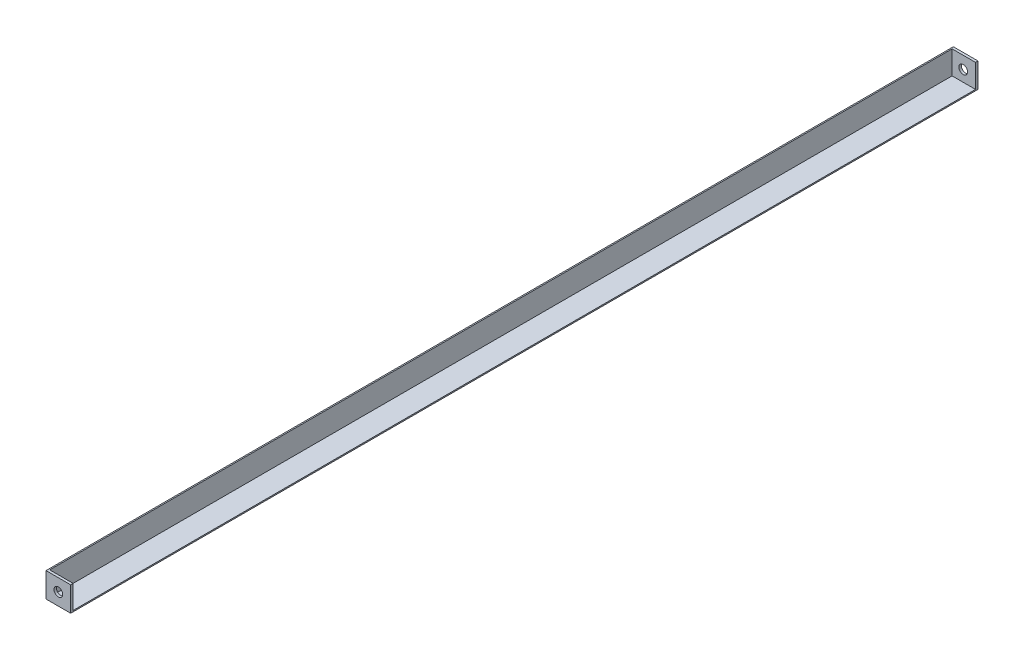
ISO-10303-21;
HEADER;
FILE_DESCRIPTION(('STEP AP214'),'2;1');
FILE_NAME('part.step','',(''),(''),'','','');
FILE_SCHEMA(('AUTOMOTIVE_DESIGN { 1 0 10303 214 1 1 1 1 }'));
ENDSEC;
DATA;
#1=APPLICATION_CONTEXT('core data for automotive mechanical design processes');
#2=APPLICATION_PROTOCOL_DEFINITION('international standard','automotive_design',2000,#1);
#3=PRODUCT_CONTEXT('',#1,'mechanical');
#4=PRODUCT('Part','Part','',(#3));
#5=PRODUCT_RELATED_PRODUCT_CATEGORY('part','',(#4));
#6=PRODUCT_DEFINITION_FORMATION('','',#4);
#7=PRODUCT_DEFINITION_CONTEXT('part definition',#1,'design');
#8=PRODUCT_DEFINITION('design','',#6,#7);
#9=PRODUCT_DEFINITION_SHAPE('','',#8);
#10=(LENGTH_UNIT() NAMED_UNIT(*) SI_UNIT(.MILLI.,.METRE.));
#11=(NAMED_UNIT(*) PLANE_ANGLE_UNIT() SI_UNIT($,.RADIAN.));
#12=(NAMED_UNIT(*) SI_UNIT($,.STERADIAN.) SOLID_ANGLE_UNIT());
#13=UNCERTAINTY_MEASURE_WITH_UNIT(LENGTH_MEASURE(1.E-05),#10,'distance_accuracy_value','');
#14=(GEOMETRIC_REPRESENTATION_CONTEXT(3) GLOBAL_UNCERTAINTY_ASSIGNED_CONTEXT((#13)) GLOBAL_UNIT_ASSIGNED_CONTEXT((#10,
#11,#12)) REPRESENTATION_CONTEXT('',''));
#15=CARTESIAN_POINT('',(0.,0.,0.));
#16=DIRECTION('',(0.,0.,1.));
#17=DIRECTION('',(1.,0.,0.));
#18=AXIS2_PLACEMENT_3D('',#15,#16,#17);
#19=CARTESIAN_POINT('',(0.,0.,584.2));
#20=DIRECTION('',(1.,0.,0.));
#21=DIRECTION('',(0.,0.,-1.));
#22=AXIS2_PLACEMENT_3D('',#19,#20,#21);
#23=PLANE('',#22);
#24=DIRECTION('',(0.,0.,-1.));
#25=VECTOR('',#24,1.);
#26=CARTESIAN_POINT('',(0.,31.75,584.2));
#27=LINE('',#26,#25);
#28=CARTESIAN_POINT('',(0.,31.75,584.2));
#29=VERTEX_POINT('',#28);
#30=CARTESIAN_POINT('',(0.,31.75,-584.2));
#31=VERTEX_POINT('',#30);
#32=EDGE_CURVE('E71',#29,#31,#27,.T.);
#33=ORIENTED_EDGE('',*,*,#32,.T.);
#34=DIRECTION('',(0.,-1.,0.));
#35=VECTOR('',#34,1.);
#36=CARTESIAN_POINT('',(0.,0.,-584.2));
#37=LINE('',#36,#35);
#38=CARTESIAN_POINT('',(0.,0.,-584.2));
#39=VERTEX_POINT('',#38);
#40=EDGE_CURVE('E158',#31,#39,#37,.T.);
#41=ORIENTED_EDGE('',*,*,#40,.T.);
#42=DIRECTION('',(0.,0.,-1.));
#43=VECTOR('',#42,1.);
#44=CARTESIAN_POINT('',(0.,0.,584.2));
#45=LINE('',#44,#43);
#46=CARTESIAN_POINT('',(0.,0.,584.2));
#47=VERTEX_POINT('',#46);
#48=EDGE_CURVE('E11',#47,#39,#45,.T.);
#49=ORIENTED_EDGE('',*,*,#48,.F.);
#50=DIRECTION('',(0.,-1.,0.));
#51=VECTOR('',#50,1.);
#52=CARTESIAN_POINT('',(0.,0.,584.2));
#53=LINE('',#52,#51);
#54=EDGE_CURVE('E159',#29,#47,#53,.T.);
#55=ORIENTED_EDGE('',*,*,#54,.F.);
#56=EDGE_LOOP('',(#33,#41,#49,#55));
#57=FACE_BOUND('',#56,.T.);
#58=ADVANCED_FACE('F35',(#57),#23,.F.);
#59=CARTESIAN_POINT('',(0.,0.,584.2));
#60=DIRECTION('',(0.,1.,0.));
#61=DIRECTION('',(0.,0.,1.));
#62=AXIS2_PLACEMENT_3D('',#59,#60,#61);
#63=PLANE('',#62);
#64=ORIENTED_EDGE('',*,*,#48,.T.);
#65=DIRECTION('',(1.,0.,0.));
#66=VECTOR('',#65,1.);
#67=CARTESIAN_POINT('',(0.,0.,-584.2));
#68=LINE('',#67,#66);
#69=CARTESIAN_POINT('',(31.75,0.,-584.2));
#70=VERTEX_POINT('',#69);
#71=EDGE_CURVE('E167',#39,#70,#68,.T.);
#72=ORIENTED_EDGE('',*,*,#71,.T.);
#73=DIRECTION('',(0.,0.,-1.));
#74=VECTOR('',#73,1.);
#75=CARTESIAN_POINT('',(31.75,0.,584.2));
#76=LINE('',#75,#74);
#77=CARTESIAN_POINT('',(31.75,0.,584.2));
#78=VERTEX_POINT('',#77);
#79=EDGE_CURVE('E43',#78,#70,#76,.T.);
#80=ORIENTED_EDGE('',*,*,#79,.F.);
#81=DIRECTION('',(1.,0.,0.));
#82=VECTOR('',#81,1.);
#83=CARTESIAN_POINT('',(0.,0.,584.2));
#84=LINE('',#83,#82);
#85=EDGE_CURVE('E75',#47,#78,#84,.T.);
#86=ORIENTED_EDGE('',*,*,#85,.F.);
#87=EDGE_LOOP('',(#64,#72,#80,#86));
#88=FACE_BOUND('',#87,.T.);
#89=ADVANCED_FACE('F196',(#88),#63,.F.);
#90=CARTESIAN_POINT('',(31.75,0.,584.2));
#91=DIRECTION('',(-1.,0.,0.));
#92=DIRECTION('',(0.,0.,1.));
#93=AXIS2_PLACEMENT_3D('',#90,#91,#92);
#94=PLANE('',#93);
#95=ORIENTED_EDGE('',*,*,#79,.T.);
#96=DIRECTION('',(0.,1.,0.));
#97=VECTOR('',#96,1.);
#98=CARTESIAN_POINT('',(31.75,0.,-584.2));
#99=LINE('',#98,#97);
#100=CARTESIAN_POINT('',(31.75,31.75,-584.2));
#101=VERTEX_POINT('',#100);
#102=EDGE_CURVE('E120',#70,#101,#99,.T.);
#103=ORIENTED_EDGE('',*,*,#102,.T.);
#104=DIRECTION('',(0.,0.,-1.));
#105=VECTOR('',#104,1.);
#106=CARTESIAN_POINT('',(31.75,31.75,-581.025));
#107=LINE('',#106,#105);
#108=CARTESIAN_POINT('',(31.75,31.75,-581.025));
#109=VERTEX_POINT('',#108);
#110=EDGE_CURVE('E115',#109,#101,#107,.T.);
#111=ORIENTED_EDGE('',*,*,#110,.F.);
#112=DIRECTION('',(0.,1.,0.));
#113=VECTOR('',#112,1.);
#114=CARTESIAN_POINT('',(31.75,0.,-581.025));
#115=LINE('',#114,#113);
#116=CARTESIAN_POINT('',(31.75,1.5875,-581.025));
#117=VERTEX_POINT('',#116);
#118=EDGE_CURVE('E105',#117,#109,#115,.T.);
#119=ORIENTED_EDGE('',*,*,#118,.F.);
#120=DIRECTION('',(0.,0.,-1.));
#121=VECTOR('',#120,1.);
#122=CARTESIAN_POINT('',(31.75,1.5875,584.2));
#123=LINE('',#122,#121);
#124=CARTESIAN_POINT('',(31.75,1.5875,581.025));
#125=VERTEX_POINT('',#124);
#126=EDGE_CURVE('E176',#125,#117,#123,.T.);
#127=ORIENTED_EDGE('',*,*,#126,.F.);
#128=DIRECTION('',(0.,1.,0.));
#129=VECTOR('',#128,1.);
#130=CARTESIAN_POINT('',(31.75,0.,581.025));
#131=LINE('',#130,#129);
#132=CARTESIAN_POINT('',(31.75,31.75,581.025));
#133=VERTEX_POINT('',#132);
#134=EDGE_CURVE('E143',#125,#133,#131,.T.);
#135=ORIENTED_EDGE('',*,*,#134,.T.);
#136=DIRECTION('',(0.,0.,1.));
#137=VECTOR('',#136,1.);
#138=CARTESIAN_POINT('',(31.75,31.75,581.025));
#139=LINE('',#138,#137);
#140=CARTESIAN_POINT('',(31.75,31.75,584.2));
#141=VERTEX_POINT('',#140);
#142=EDGE_CURVE('E149',#133,#141,#139,.T.);
#143=ORIENTED_EDGE('',*,*,#142,.T.);
#144=DIRECTION('',(0.,1.,0.));
#145=VECTOR('',#144,1.);
#146=CARTESIAN_POINT('',(31.75,0.,584.2));
#147=LINE('',#146,#145);
#148=EDGE_CURVE('E163',#78,#141,#147,.T.);
#149=ORIENTED_EDGE('',*,*,#148,.F.);
#150=EDGE_LOOP('',(#95,#103,#111,#119,#127,#135,#143,#149));
#151=FACE_BOUND('',#150,.T.);
#152=ADVANCED_FACE('F118',(#151),#94,.F.);
#153=CARTESIAN_POINT('',(31.75,1.5875,584.2));
#154=DIRECTION('',(0.,-1.,0.));
#155=DIRECTION('',(1.,0.,0.));
#156=AXIS2_PLACEMENT_3D('',#153,#154,#155);
#157=PLANE('',#156);
#158=ORIENTED_EDGE('',*,*,#126,.T.);
#159=DIRECTION('',(-1.,0.,0.));
#160=VECTOR('',#159,1.);
#161=CARTESIAN_POINT('',(31.75,1.5875,-581.025));
#162=LINE('',#161,#160);
#163=CARTESIAN_POINT('',(1.5875,1.5875,-581.025));
#164=VERTEX_POINT('',#163);
#165=EDGE_CURVE('E112',#117,#164,#162,.T.);
#166=ORIENTED_EDGE('',*,*,#165,.T.);
#167=DIRECTION('',(0.,0.,-1.));
#168=VECTOR('',#167,1.);
#169=CARTESIAN_POINT('',(1.5875,1.5875,584.2));
#170=LINE('',#169,#168);
#171=CARTESIAN_POINT('',(1.5875,1.5875,581.025));
#172=VERTEX_POINT('',#171);
#173=EDGE_CURVE('E173',#172,#164,#170,.T.);
#174=ORIENTED_EDGE('',*,*,#173,.F.);
#175=DIRECTION('',(1.,0.,0.));
#176=VECTOR('',#175,1.);
#177=CARTESIAN_POINT('',(31.75,1.5875,581.025));
#178=LINE('',#177,#176);
#179=EDGE_CURVE('E155',#172,#125,#178,.T.);
#180=ORIENTED_EDGE('',*,*,#179,.T.);
#181=EDGE_LOOP('',(#158,#166,#174,#180));
#182=FACE_BOUND('',#181,.T.);
#183=ADVANCED_FACE('F178',(#182),#157,.F.);
#184=CARTESIAN_POINT('',(1.5875,1.5875,584.2));
#185=DIRECTION('',(-1.,0.,0.));
#186=DIRECTION('',(0.,0.,1.));
#187=AXIS2_PLACEMENT_3D('',#184,#185,#186);
#188=PLANE('',#187);
#189=ORIENTED_EDGE('',*,*,#173,.T.);
#190=DIRECTION('',(0.,1.,0.));
#191=VECTOR('',#190,1.);
#192=CARTESIAN_POINT('',(1.5875,1.5875,-581.025));
#193=LINE('',#192,#191);
#194=CARTESIAN_POINT('',(1.5875,31.75,-581.025));
#195=VERTEX_POINT('',#194);
#196=EDGE_CURVE('E123',#164,#195,#193,.T.);
#197=ORIENTED_EDGE('',*,*,#196,.T.);
#198=DIRECTION('',(0.,0.,-1.));
#199=VECTOR('',#198,1.);
#200=CARTESIAN_POINT('',(1.5875,31.75,584.2));
#201=LINE('',#200,#199);
#202=CARTESIAN_POINT('',(1.5875,31.75,581.025));
#203=VERTEX_POINT('',#202);
#204=EDGE_CURVE('E129',#203,#195,#201,.T.);
#205=ORIENTED_EDGE('',*,*,#204,.F.);
#206=DIRECTION('',(0.,-1.,0.));
#207=VECTOR('',#206,1.);
#208=CARTESIAN_POINT('',(1.5875,1.5875,581.025));
#209=LINE('',#208,#207);
#210=EDGE_CURVE('E152',#203,#172,#209,.T.);
#211=ORIENTED_EDGE('',*,*,#210,.T.);
#212=EDGE_LOOP('',(#189,#197,#205,#211));
#213=FACE_BOUND('',#212,.T.);
#214=ADVANCED_FACE('F185',(#213),#188,.F.);
#215=CARTESIAN_POINT('',(0.,31.75,584.2));
#216=DIRECTION('',(0.,-1.,0.));
#217=DIRECTION('',(0.,0.,-1.));
#218=AXIS2_PLACEMENT_3D('',#215,#216,#217);
#219=PLANE('',#218);
#220=ORIENTED_EDGE('',*,*,#204,.T.);
#221=DIRECTION('',(-1.,0.,0.));
#222=VECTOR('',#221,1.);
#223=CARTESIAN_POINT('',(0.,31.75,-581.025));
#224=LINE('',#223,#222);
#225=EDGE_CURVE('E109',#109,#195,#224,.T.);
#226=ORIENTED_EDGE('',*,*,#225,.F.);
#227=ORIENTED_EDGE('',*,*,#110,.T.);
#228=DIRECTION('',(-1.,0.,0.));
#229=VECTOR('',#228,1.);
#230=CARTESIAN_POINT('',(0.,31.75,-584.2));
#231=LINE('',#230,#229);
#232=EDGE_CURVE('E161',#101,#31,#231,.T.);
#233=ORIENTED_EDGE('',*,*,#232,.T.);
#234=ORIENTED_EDGE('',*,*,#32,.F.);
#235=DIRECTION('',(-1.,0.,0.));
#236=VECTOR('',#235,1.);
#237=CARTESIAN_POINT('',(0.,31.75,584.2));
#238=LINE('',#237,#236);
#239=EDGE_CURVE('E51',#141,#29,#238,.T.);
#240=ORIENTED_EDGE('',*,*,#239,.F.);
#241=ORIENTED_EDGE('',*,*,#142,.F.);
#242=DIRECTION('',(-1.,0.,0.));
#243=VECTOR('',#242,1.);
#244=CARTESIAN_POINT('',(0.,31.75,581.025));
#245=LINE('',#244,#243);
#246=EDGE_CURVE('E147',#133,#203,#245,.T.);
#247=ORIENTED_EDGE('',*,*,#246,.T.);
#248=EDGE_LOOP('',(#220,#226,#227,#233,#234,#240,#241,#247));
#249=FACE_BOUND('',#248,.T.);
#250=ADVANCED_FACE('F126',(#249),#219,.F.);
#251=CARTESIAN_POINT('',(0.,0.,584.2));
#252=DIRECTION('',(0.,0.,-1.));
#253=DIRECTION('',(-1.,0.,0.));
#254=AXIS2_PLACEMENT_3D('',#251,#252,#253);
#255=PLANE('',#254);
#256=ORIENTED_EDGE('',*,*,#54,.T.);
#257=ORIENTED_EDGE('',*,*,#85,.T.);
#258=ORIENTED_EDGE('',*,*,#148,.T.);
#259=ORIENTED_EDGE('',*,*,#239,.T.);
#260=EDGE_LOOP('',(#256,#257,#258,#259));
#261=FACE_BOUND('',#260,.T.);
#262=CARTESIAN_POINT('',(15.875,15.875,584.2));
#263=DIRECTION('',(0.,0.,1.));
#264=DIRECTION('',(1.,0.,0.));
#265=AXIS2_PLACEMENT_3D('',#262,#263,#264);
#266=CIRCLE('',#265,5.588);
#267=CARTESIAN_POINT('',(21.463,15.875,584.2));
#268=VERTEX_POINT('',#267);
#269=EDGE_CURVE('E139',#268,#268,#266,.T.);
#270=ORIENTED_EDGE('',*,*,#269,.F.);
#271=EDGE_LOOP('',(#270));
#272=FACE_BOUND('',#271,.T.);
#273=ADVANCED_FACE('F192',(#261,#272),#255,.F.);
#274=CARTESIAN_POINT('',(0.,0.,-584.2));
#275=DIRECTION('',(0.,0.,-1.));
#276=DIRECTION('',(-1.,0.,0.));
#277=AXIS2_PLACEMENT_3D('',#274,#275,#276);
#278=PLANE('',#277);
#279=ORIENTED_EDGE('',*,*,#40,.F.);
#280=ORIENTED_EDGE('',*,*,#232,.F.);
#281=ORIENTED_EDGE('',*,*,#102,.F.);
#282=ORIENTED_EDGE('',*,*,#71,.F.);
#283=EDGE_LOOP('',(#279,#280,#281,#282));
#284=FACE_BOUND('',#283,.T.);
#285=CARTESIAN_POINT('',(15.875,15.875,-584.2));
#286=DIRECTION('',(0.,0.,1.));
#287=DIRECTION('',(1.,0.,0.));
#288=AXIS2_PLACEMENT_3D('',#285,#286,#287);
#289=CIRCLE('',#288,5.588);
#290=CARTESIAN_POINT('',(21.463,15.875,-584.2));
#291=VERTEX_POINT('',#290);
#292=EDGE_CURVE('E133',#291,#291,#289,.T.);
#293=ORIENTED_EDGE('',*,*,#292,.T.);
#294=EDGE_LOOP('',(#293));
#295=FACE_BOUND('',#294,.T.);
#296=ADVANCED_FACE('F208',(#284,#295),#278,.T.);
#297=CARTESIAN_POINT('',(0.,0.,581.025));
#298=DIRECTION('',(0.,0.,-1.));
#299=DIRECTION('',(-1.,0.,0.));
#300=AXIS2_PLACEMENT_3D('',#297,#298,#299);
#301=PLANE('',#300);
#302=CARTESIAN_POINT('',(15.875,15.875,581.025));
#303=DIRECTION('',(0.,0.,1.));
#304=DIRECTION('',(1.,0.,0.));
#305=AXIS2_PLACEMENT_3D('',#302,#303,#304);
#306=CIRCLE('',#305,5.588);
#307=CARTESIAN_POINT('',(21.463,15.875,581.025));
#308=VERTEX_POINT('',#307);
#309=EDGE_CURVE('E140',#308,#308,#306,.T.);
#310=ORIENTED_EDGE('',*,*,#309,.T.);
#311=EDGE_LOOP('',(#310));
#312=FACE_BOUND('',#311,.T.);
#313=ORIENTED_EDGE('',*,*,#179,.F.);
#314=ORIENTED_EDGE('',*,*,#210,.F.);
#315=ORIENTED_EDGE('',*,*,#246,.F.);
#316=ORIENTED_EDGE('',*,*,#134,.F.);
#317=EDGE_LOOP('',(#313,#314,#315,#316));
#318=FACE_BOUND('',#317,.T.);
#319=ADVANCED_FACE('F183',(#312,#318),#301,.T.);
#320=CARTESIAN_POINT('',(15.875,15.875,581.025));
#321=DIRECTION('',(0.,0.,1.));
#322=DIRECTION('',(1.,0.,0.));
#323=AXIS2_PLACEMENT_3D('',#320,#321,#322);
#324=CYLINDRICAL_SURFACE('',#323,5.588);
#325=ORIENTED_EDGE('',*,*,#309,.F.);
#326=EDGE_LOOP('',(#325));
#327=FACE_BOUND('',#326,.T.);
#328=ORIENTED_EDGE('',*,*,#269,.T.);
#329=EDGE_LOOP('',(#328));
#330=FACE_BOUND('',#329,.T.);
#331=ADVANCED_FACE('F215',(#327,#330),#324,.F.);
#332=CARTESIAN_POINT('',(0.,0.,-581.025));
#333=DIRECTION('',(0.,0.,1.));
#334=DIRECTION('',(-1.,0.,0.));
#335=AXIS2_PLACEMENT_3D('',#332,#333,#334);
#336=PLANE('',#335);
#337=CARTESIAN_POINT('',(15.875,15.875,-581.025));
#338=DIRECTION('',(0.,0.,1.));
#339=DIRECTION('',(1.,0.,0.));
#340=AXIS2_PLACEMENT_3D('',#337,#338,#339);
#341=CIRCLE('',#340,5.588);
#342=CARTESIAN_POINT('',(21.463,15.875,-581.025));
#343=VERTEX_POINT('',#342);
#344=EDGE_CURVE('E130',#343,#343,#341,.T.);
#345=ORIENTED_EDGE('',*,*,#344,.F.);
#346=EDGE_LOOP('',(#345));
#347=FACE_BOUND('',#346,.T.);
#348=ORIENTED_EDGE('',*,*,#165,.F.);
#349=ORIENTED_EDGE('',*,*,#118,.T.);
#350=ORIENTED_EDGE('',*,*,#225,.T.);
#351=ORIENTED_EDGE('',*,*,#196,.F.);
#352=EDGE_LOOP('',(#348,#349,#350,#351));
#353=FACE_BOUND('',#352,.T.);
#354=ADVANCED_FACE('F107',(#347,#353),#336,.T.);
#355=CARTESIAN_POINT('',(15.875,15.875,-581.025));
#356=DIRECTION('',(0.,0.,-1.));
#357=DIRECTION('',(-1.,0.,0.));
#358=AXIS2_PLACEMENT_3D('',#355,#356,#357);
#359=CYLINDRICAL_SURFACE('',#358,5.588);
#360=ORIENTED_EDGE('',*,*,#344,.T.);
#361=EDGE_LOOP('',(#360));
#362=FACE_BOUND('',#361,.T.);
#363=ORIENTED_EDGE('',*,*,#292,.F.);
#364=EDGE_LOOP('',(#363));
#365=FACE_BOUND('',#364,.T.);
#366=ADVANCED_FACE('F223',(#362,#365),#359,.F.);
#367=CLOSED_SHELL('',(#58,#89,#152,#183,#214,#250,#273,#296,#319,#331,#354,#366));
#368=MANIFOLD_SOLID_BREP('B2',#367);
#369=ADVANCED_BREP_SHAPE_REPRESENTATION('',(#18,#368),#14);
#370=SHAPE_DEFINITION_REPRESENTATION(#9,#369);
ENDSEC;
END-ISO-10303-21;
